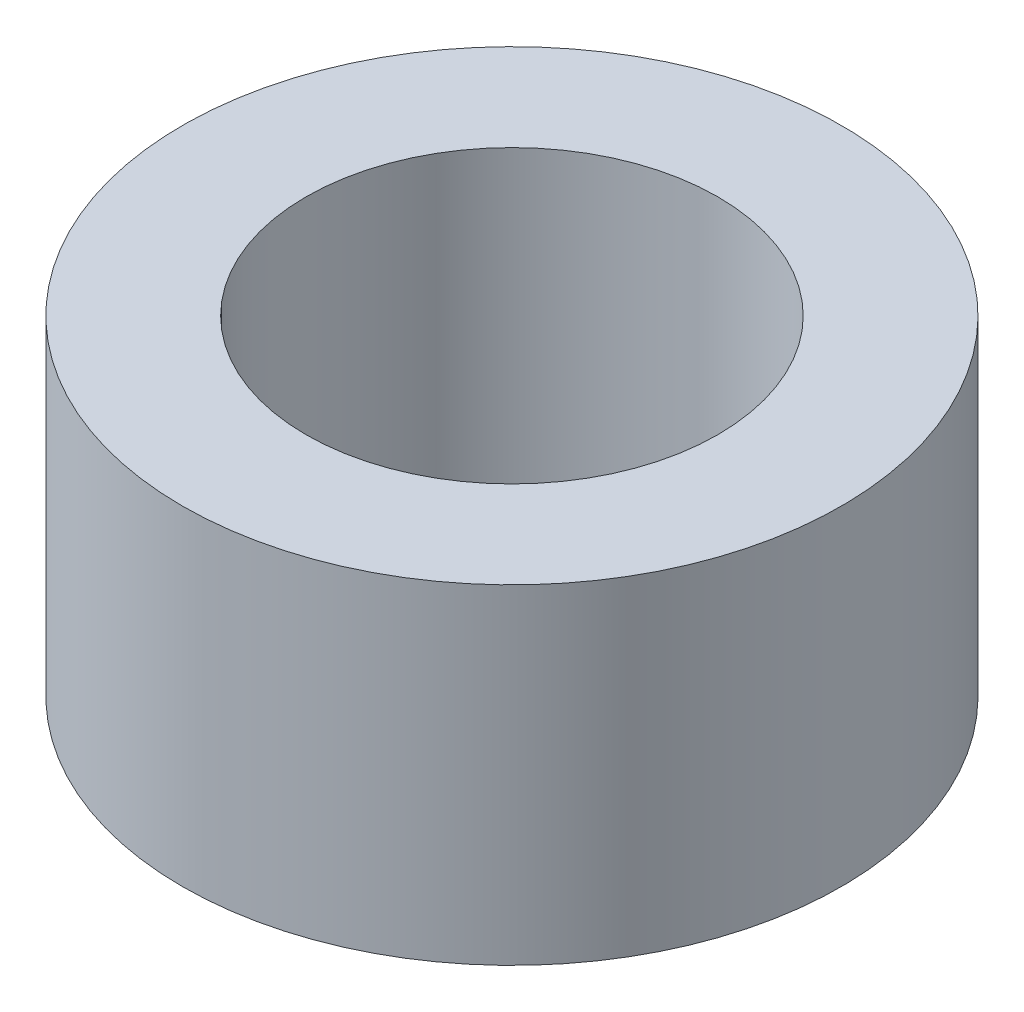
ISO-10303-21;
HEADER;
FILE_DESCRIPTION(('STEP AP214'),'2;1');
FILE_NAME('part.step','',(''),(''),'','','');
FILE_SCHEMA(('AUTOMOTIVE_DESIGN { 1 0 10303 214 1 1 1 1 }'));
ENDSEC;
DATA;
#1=APPLICATION_CONTEXT('core data for automotive mechanical design processes');
#2=APPLICATION_PROTOCOL_DEFINITION('international standard','automotive_design',2000,#1);
#3=PRODUCT_CONTEXT('',#1,'mechanical');
#4=PRODUCT('Part','Part','',(#3));
#5=PRODUCT_RELATED_PRODUCT_CATEGORY('part','',(#4));
#6=PRODUCT_DEFINITION_FORMATION('','',#4);
#7=PRODUCT_DEFINITION_CONTEXT('part definition',#1,'design');
#8=PRODUCT_DEFINITION('design','',#6,#7);
#9=PRODUCT_DEFINITION_SHAPE('','',#8);
#10=(LENGTH_UNIT() NAMED_UNIT(*) SI_UNIT(.MILLI.,.METRE.));
#11=(NAMED_UNIT(*) PLANE_ANGLE_UNIT() SI_UNIT($,.RADIAN.));
#12=(NAMED_UNIT(*) SI_UNIT($,.STERADIAN.) SOLID_ANGLE_UNIT());
#13=UNCERTAINTY_MEASURE_WITH_UNIT(LENGTH_MEASURE(1.E-05),#10,'distance_accuracy_value','');
#14=(GEOMETRIC_REPRESENTATION_CONTEXT(3) GLOBAL_UNCERTAINTY_ASSIGNED_CONTEXT((#13)) GLOBAL_UNIT_ASSIGNED_CONTEXT((#10,
#11,#12)) REPRESENTATION_CONTEXT('',''));
#15=CARTESIAN_POINT('',(0.,0.,0.));
#16=DIRECTION('',(0.,0.,1.));
#17=DIRECTION('',(1.,0.,0.));
#18=AXIS2_PLACEMENT_3D('',#15,#16,#17);
#19=CARTESIAN_POINT('',(0.,2.5,0.));
#20=DIRECTION('',(0.,1.,0.));
#21=DIRECTION('',(0.,0.,1.));
#22=AXIS2_PLACEMENT_3D('',#19,#20,#21);
#23=PLANE('',#22);
#24=CARTESIAN_POINT('',(0.,2.5,0.));
#25=DIRECTION('',(0.,1.,0.));
#26=DIRECTION('',(0.,0.,1.));
#27=AXIS2_PLACEMENT_3D('',#24,#25,#26);
#28=CIRCLE('',#27,5.);
#29=CARTESIAN_POINT('',(0.,2.5,5.));
#30=VERTEX_POINT('',#29);
#31=EDGE_CURVE('E10',#30,#30,#28,.T.);
#32=ORIENTED_EDGE('',*,*,#31,.T.);
#33=EDGE_LOOP('',(#32));
#34=FACE_BOUND('',#33,.T.);
#35=CARTESIAN_POINT('',(0.,2.5,0.));
#36=DIRECTION('',(0.,1.,0.));
#37=DIRECTION('',(0.,0.,1.));
#38=AXIS2_PLACEMENT_3D('',#35,#36,#37);
#39=CIRCLE('',#38,3.125);
#40=CARTESIAN_POINT('',(0.,2.5,3.125));
#41=VERTEX_POINT('',#40);
#42=EDGE_CURVE('E56',#41,#41,#39,.T.);
#43=ORIENTED_EDGE('',*,*,#42,.F.);
#44=EDGE_LOOP('',(#43));
#45=FACE_BOUND('',#44,.T.);
#46=ADVANCED_FACE('F43',(#34,#45),#23,.T.);
#47=CARTESIAN_POINT('',(0.,-2.5,0.));
#48=DIRECTION('',(0.,1.,0.));
#49=DIRECTION('',(0.,0.,1.));
#50=AXIS2_PLACEMENT_3D('',#47,#48,#49);
#51=PLANE('',#50);
#52=CARTESIAN_POINT('',(0.,-2.5,0.));
#53=DIRECTION('',(0.,1.,0.));
#54=DIRECTION('',(0.,0.,1.));
#55=AXIS2_PLACEMENT_3D('',#52,#53,#54);
#56=CIRCLE('',#55,5.);
#57=CARTESIAN_POINT('',(0.,-2.5,5.));
#58=VERTEX_POINT('',#57);
#59=EDGE_CURVE('E47',#58,#58,#56,.T.);
#60=ORIENTED_EDGE('',*,*,#59,.F.);
#61=EDGE_LOOP('',(#60));
#62=FACE_BOUND('',#61,.T.);
#63=CARTESIAN_POINT('',(0.,-2.5,0.));
#64=DIRECTION('',(0.,1.,0.));
#65=DIRECTION('',(0.,0.,1.));
#66=AXIS2_PLACEMENT_3D('',#63,#64,#65);
#67=CIRCLE('',#66,3.125);
#68=CARTESIAN_POINT('',(0.,-2.5,3.125));
#69=VERTEX_POINT('',#68);
#70=EDGE_CURVE('E58',#69,#69,#67,.T.);
#71=ORIENTED_EDGE('',*,*,#70,.T.);
#72=EDGE_LOOP('',(#71));
#73=FACE_BOUND('',#72,.T.);
#74=ADVANCED_FACE('F70',(#62,#73),#51,.F.);
#75=CARTESIAN_POINT('',(0.,2.5,0.));
#76=DIRECTION('',(0.,-1.,0.));
#77=DIRECTION('',(0.,0.,-1.));
#78=AXIS2_PLACEMENT_3D('',#75,#76,#77);
#79=CYLINDRICAL_SURFACE('',#78,5.);
#80=ORIENTED_EDGE('',*,*,#31,.F.);
#81=EDGE_LOOP('',(#80));
#82=FACE_BOUND('',#81,.T.);
#83=ORIENTED_EDGE('',*,*,#59,.T.);
#84=EDGE_LOOP('',(#83));
#85=FACE_BOUND('',#84,.T.);
#86=ADVANCED_FACE('F45',(#82,#85),#79,.T.);
#87=CARTESIAN_POINT('',(0.,2.5,0.));
#88=DIRECTION('',(0.,-1.,0.));
#89=DIRECTION('',(0.,0.,-1.));
#90=AXIS2_PLACEMENT_3D('',#87,#88,#89);
#91=CYLINDRICAL_SURFACE('',#90,3.125);
#92=ORIENTED_EDGE('',*,*,#42,.T.);
#93=EDGE_LOOP('',(#92));
#94=FACE_BOUND('',#93,.T.);
#95=ORIENTED_EDGE('',*,*,#70,.F.);
#96=EDGE_LOOP('',(#95));
#97=FACE_BOUND('',#96,.T.);
#98=ADVANCED_FACE('F66',(#94,#97),#91,.F.);
#99=CLOSED_SHELL('',(#46,#74,#86,#98));
#100=MANIFOLD_SOLID_BREP('B2',#99);
#101=ADVANCED_BREP_SHAPE_REPRESENTATION('',(#18,#100),#14);
#102=SHAPE_DEFINITION_REPRESENTATION(#9,#101);
ENDSEC;
END-ISO-10303-21;
